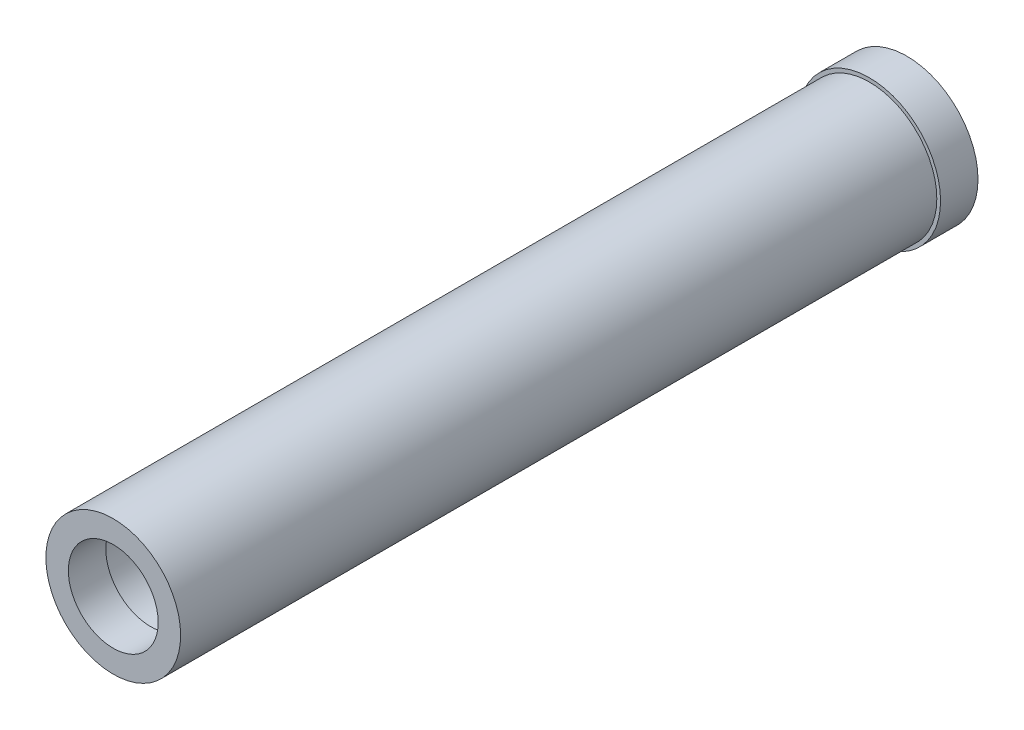
ISO-10303-21;
HEADER;
FILE_DESCRIPTION(('STEP AP214'),'2;1');
FILE_NAME('part.step','',(''),(''),'','','');
FILE_SCHEMA(('AUTOMOTIVE_DESIGN { 1 0 10303 214 1 1 1 1 }'));
ENDSEC;
DATA;
#1=APPLICATION_CONTEXT('core data for automotive mechanical design processes');
#2=APPLICATION_PROTOCOL_DEFINITION('international standard','automotive_design',2000,#1);
#3=PRODUCT_CONTEXT('',#1,'mechanical');
#4=PRODUCT('Part','Part','',(#3));
#5=PRODUCT_RELATED_PRODUCT_CATEGORY('part','',(#4));
#6=PRODUCT_DEFINITION_FORMATION('','',#4);
#7=PRODUCT_DEFINITION_CONTEXT('part definition',#1,'design');
#8=PRODUCT_DEFINITION('design','',#6,#7);
#9=PRODUCT_DEFINITION_SHAPE('','',#8);
#10=(LENGTH_UNIT() NAMED_UNIT(*) SI_UNIT(.MILLI.,.METRE.));
#11=(NAMED_UNIT(*) PLANE_ANGLE_UNIT() SI_UNIT($,.RADIAN.));
#12=(NAMED_UNIT(*) SI_UNIT($,.STERADIAN.) SOLID_ANGLE_UNIT());
#13=UNCERTAINTY_MEASURE_WITH_UNIT(LENGTH_MEASURE(1.E-05),#10,'distance_accuracy_value','');
#14=(GEOMETRIC_REPRESENTATION_CONTEXT(3) GLOBAL_UNCERTAINTY_ASSIGNED_CONTEXT((#13)) GLOBAL_UNIT_ASSIGNED_CONTEXT((#10,
#11,#12)) REPRESENTATION_CONTEXT('',''));
#15=CARTESIAN_POINT('',(0.,0.,0.));
#16=DIRECTION('',(0.,0.,1.));
#17=DIRECTION('',(1.,0.,0.));
#18=AXIS2_PLACEMENT_3D('',#15,#16,#17);
#19=CARTESIAN_POINT('',(0.,0.,10.));
#20=DIRECTION('',(0.,0.,-1.));
#21=DIRECTION('',(-1.,0.,0.));
#22=AXIS2_PLACEMENT_3D('',#19,#20,#21);
#23=CYLINDRICAL_SURFACE('',#22,19.);
#24=CARTESIAN_POINT('',(0.,0.,10.));
#25=DIRECTION('',(0.,0.,1.));
#26=DIRECTION('',(1.,0.,0.));
#27=AXIS2_PLACEMENT_3D('',#24,#25,#26);
#28=CIRCLE('',#27,19.);
#29=CARTESIAN_POINT('',(19.,0.,10.));
#30=VERTEX_POINT('',#29);
#31=EDGE_CURVE('E55',#30,#30,#28,.T.);
#32=ORIENTED_EDGE('',*,*,#31,.F.);
#33=EDGE_LOOP('',(#32));
#34=FACE_BOUND('',#33,.T.);
#35=CARTESIAN_POINT('',(0.,0.,0.));
#36=DIRECTION('',(0.,0.,1.));
#37=DIRECTION('',(1.,0.,0.));
#38=AXIS2_PLACEMENT_3D('',#35,#36,#37);
#39=CIRCLE('',#38,19.);
#40=CARTESIAN_POINT('',(19.,0.,0.));
#41=VERTEX_POINT('',#40);
#42=EDGE_CURVE('E60',#41,#41,#39,.T.);
#43=ORIENTED_EDGE('',*,*,#42,.T.);
#44=EDGE_LOOP('',(#43));
#45=FACE_BOUND('',#44,.T.);
#46=ADVANCED_FACE('F45',(#34,#45),#23,.T.);
#47=CARTESIAN_POINT('',(0.,0.,0.));
#48=DIRECTION('',(0.,0.,1.));
#49=DIRECTION('',(1.,0.,0.));
#50=AXIS2_PLACEMENT_3D('',#47,#48,#49);
#51=PLANE('',#50);
#52=ORIENTED_EDGE('',*,*,#42,.F.);
#53=EDGE_LOOP('',(#52));
#54=FACE_BOUND('',#53,.T.);
#55=ADVANCED_FACE('F102',(#54),#51,.F.);
#56=CARTESIAN_POINT('',(0.,0.,10.));
#57=DIRECTION('',(0.,0.,1.));
#58=DIRECTION('',(1.,0.,0.));
#59=AXIS2_PLACEMENT_3D('',#56,#57,#58);
#60=PLANE('',#59);
#61=CARTESIAN_POINT('',(0.,0.,10.));
#62=DIRECTION('',(0.,0.,1.));
#63=DIRECTION('',(1.,0.,0.));
#64=AXIS2_PLACEMENT_3D('',#61,#62,#63);
#65=CIRCLE('',#64,18.);
#66=CARTESIAN_POINT('',(18.,0.,10.));
#67=VERTEX_POINT('',#66);
#68=EDGE_CURVE('E51',#67,#67,#65,.T.);
#69=ORIENTED_EDGE('',*,*,#68,.F.);
#70=EDGE_LOOP('',(#69));
#71=FACE_BOUND('',#70,.T.);
#72=ORIENTED_EDGE('',*,*,#31,.T.);
#73=EDGE_LOOP('',(#72));
#74=FACE_BOUND('',#73,.T.);
#75=ADVANCED_FACE('F97',(#71,#74),#60,.T.);
#76=CARTESIAN_POINT('',(0.,0.,212.));
#77=DIRECTION('',(0.,0.,-1.));
#78=DIRECTION('',(-1.,0.,0.));
#79=AXIS2_PLACEMENT_3D('',#76,#77,#78);
#80=CYLINDRICAL_SURFACE('',#79,18.);
#81=CARTESIAN_POINT('',(0.,0.,212.));
#82=DIRECTION('',(0.,0.,1.));
#83=DIRECTION('',(1.,0.,0.));
#84=AXIS2_PLACEMENT_3D('',#81,#82,#83);
#85=CIRCLE('',#84,18.);
#86=CARTESIAN_POINT('',(18.,0.,212.));
#87=VERTEX_POINT('',#86);
#88=EDGE_CURVE('E63',#87,#87,#85,.T.);
#89=ORIENTED_EDGE('',*,*,#88,.F.);
#90=EDGE_LOOP('',(#89));
#91=FACE_BOUND('',#90,.T.);
#92=ORIENTED_EDGE('',*,*,#68,.T.);
#93=EDGE_LOOP('',(#92));
#94=FACE_BOUND('',#93,.T.);
#95=ADVANCED_FACE('F88',(#91,#94),#80,.T.);
#96=CARTESIAN_POINT('',(0.,0.,212.));
#97=DIRECTION('',(0.,0.,1.));
#98=DIRECTION('',(1.,0.,0.));
#99=AXIS2_PLACEMENT_3D('',#96,#97,#98);
#100=PLANE('',#99);
#101=ORIENTED_EDGE('',*,*,#88,.T.);
#102=EDGE_LOOP('',(#101));
#103=FACE_BOUND('',#102,.T.);
#104=CARTESIAN_POINT('',(0.,0.,212.));
#105=DIRECTION('',(0.,0.,1.));
#106=DIRECTION('',(1.,0.,0.));
#107=AXIS2_PLACEMENT_3D('',#104,#105,#106);
#108=CIRCLE('',#107,12.);
#109=CARTESIAN_POINT('',(12.,0.,212.));
#110=VERTEX_POINT('',#109);
#111=EDGE_CURVE('E77',#110,#110,#108,.T.);
#112=ORIENTED_EDGE('',*,*,#111,.F.);
#113=EDGE_LOOP('',(#112));
#114=FACE_BOUND('',#113,.T.);
#115=ADVANCED_FACE('F85',(#103,#114),#100,.T.);
#116=CARTESIAN_POINT('',(0.,0.,202.));
#117=DIRECTION('',(0.,0.,1.));
#118=DIRECTION('',(1.,0.,0.));
#119=AXIS2_PLACEMENT_3D('',#116,#117,#118);
#120=PLANE('',#119);
#121=CARTESIAN_POINT('',(0.,0.,202.));
#122=DIRECTION('',(0.,0.,1.));
#123=DIRECTION('',(1.,0.,0.));
#124=AXIS2_PLACEMENT_3D('',#121,#122,#123);
#125=CIRCLE('',#124,12.);
#126=CARTESIAN_POINT('',(12.,0.,202.));
#127=VERTEX_POINT('',#126);
#128=EDGE_CURVE('E73',#127,#127,#125,.T.);
#129=ORIENTED_EDGE('',*,*,#128,.T.);
#130=EDGE_LOOP('',(#129));
#131=FACE_BOUND('',#130,.T.);
#132=CARTESIAN_POINT('',(0.,0.,202.));
#133=DIRECTION('',(0.,0.,1.));
#134=DIRECTION('',(1.,0.,0.));
#135=AXIS2_PLACEMENT_3D('',#132,#133,#134);
#136=CIRCLE('',#135,13.);
#137=CARTESIAN_POINT('',(13.,0.,202.));
#138=VERTEX_POINT('',#137);
#139=EDGE_CURVE('E11',#138,#138,#136,.F.);
#140=ORIENTED_EDGE('',*,*,#139,.T.);
#141=EDGE_LOOP('',(#140));
#142=FACE_BOUND('',#141,.T.);
#143=ADVANCED_FACE('F87',(#131,#142),#120,.F.);
#144=CARTESIAN_POINT('',(0.,0.,202.));
#145=DIRECTION('',(0.,0.,1.));
#146=DIRECTION('',(1.,0.,0.));
#147=AXIS2_PLACEMENT_3D('',#144,#145,#146);
#148=CYLINDRICAL_SURFACE('',#147,12.);
#149=ORIENTED_EDGE('',*,*,#128,.F.);
#150=EDGE_LOOP('',(#149));
#151=FACE_BOUND('',#150,.T.);
#152=ORIENTED_EDGE('',*,*,#111,.T.);
#153=EDGE_LOOP('',(#152));
#154=FACE_BOUND('',#153,.T.);
#155=ADVANCED_FACE('F83',(#151,#154),#148,.F.);
#156=CARTESIAN_POINT('',(0.,0.,12.));
#157=DIRECTION('',(0.,0.,1.));
#158=DIRECTION('',(1.,0.,0.));
#159=AXIS2_PLACEMENT_3D('',#156,#157,#158);
#160=PLANE('',#159);
#161=CARTESIAN_POINT('',(0.,0.,12.));
#162=DIRECTION('',(0.,0.,1.));
#163=DIRECTION('',(1.,0.,0.));
#164=AXIS2_PLACEMENT_3D('',#161,#162,#163);
#165=CIRCLE('',#164,13.);
#166=CARTESIAN_POINT('',(13.,0.,12.));
#167=VERTEX_POINT('',#166);
#168=EDGE_CURVE('E69',#167,#167,#165,.T.);
#169=ORIENTED_EDGE('',*,*,#168,.T.);
#170=EDGE_LOOP('',(#169));
#171=FACE_BOUND('',#170,.T.);
#172=ADVANCED_FACE('F126',(#171),#160,.T.);
#173=CARTESIAN_POINT('',(0.,0.,12.));
#174=DIRECTION('',(0.,0.,1.));
#175=DIRECTION('',(1.,0.,0.));
#176=AXIS2_PLACEMENT_3D('',#173,#174,#175);
#177=CYLINDRICAL_SURFACE('',#176,13.);
#178=ORIENTED_EDGE('',*,*,#168,.F.);
#179=EDGE_LOOP('',(#178));
#180=FACE_BOUND('',#179,.T.);
#181=ORIENTED_EDGE('',*,*,#139,.F.);
#182=EDGE_LOOP('',(#181));
#183=FACE_BOUND('',#182,.T.);
#184=ADVANCED_FACE('F129',(#180,#183),#177,.F.);
#185=CLOSED_SHELL('',(#46,#55,#75,#95,#115,#143,#155,#172,#184));
#186=MANIFOLD_SOLID_BREP('B2',#185);
#187=ADVANCED_BREP_SHAPE_REPRESENTATION('',(#18,#186),#14);
#188=SHAPE_DEFINITION_REPRESENTATION(#9,#187);
ENDSEC;
END-ISO-10303-21;
